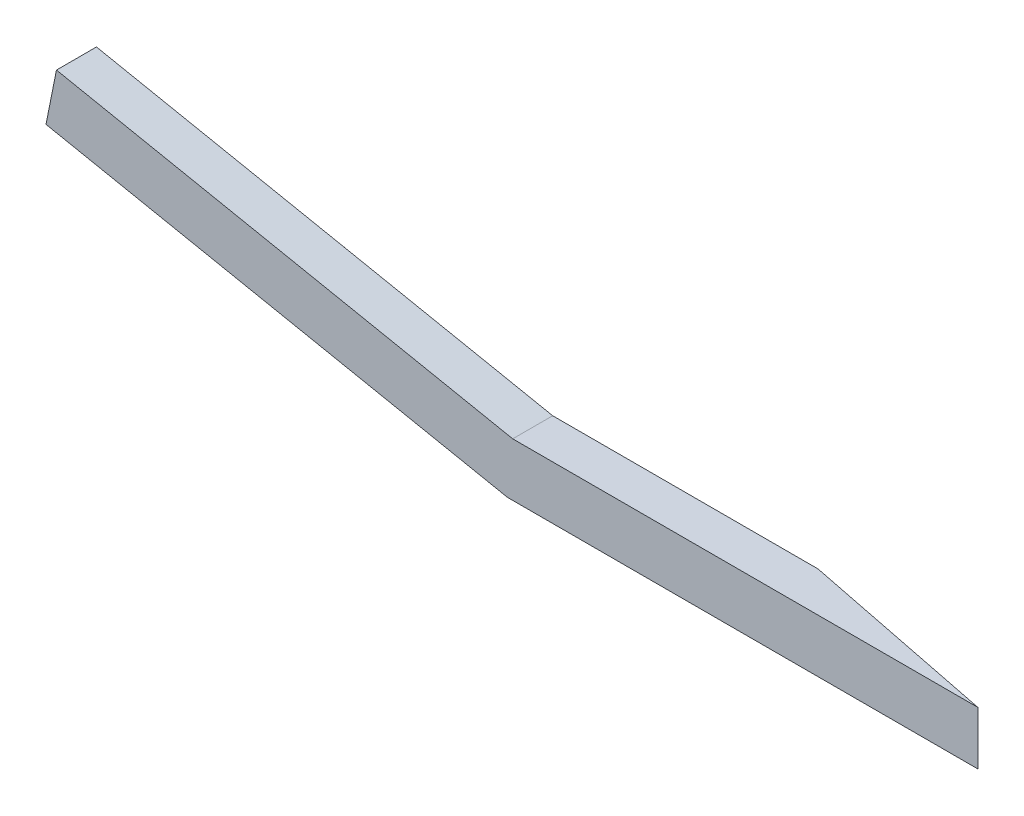
ISO-10303-21;
HEADER;
FILE_DESCRIPTION(('STEP AP214'),'2;1');
FILE_NAME('part.step','',(''),(''),'','','');
FILE_SCHEMA(('AUTOMOTIVE_DESIGN { 1 0 10303 214 1 1 1 1 }'));
ENDSEC;
DATA;
#1=APPLICATION_CONTEXT('core data for automotive mechanical design processes');
#2=APPLICATION_PROTOCOL_DEFINITION('international standard','automotive_design',2000,#1);
#3=PRODUCT_CONTEXT('',#1,'mechanical');
#4=PRODUCT('Part','Part','',(#3));
#5=PRODUCT_RELATED_PRODUCT_CATEGORY('part','',(#4));
#6=PRODUCT_DEFINITION_FORMATION('','',#4);
#7=PRODUCT_DEFINITION_CONTEXT('part definition',#1,'design');
#8=PRODUCT_DEFINITION('design','',#6,#7);
#9=PRODUCT_DEFINITION_SHAPE('','',#8);
#10=(LENGTH_UNIT() NAMED_UNIT(*) SI_UNIT(.MILLI.,.METRE.));
#11=(NAMED_UNIT(*) PLANE_ANGLE_UNIT() SI_UNIT($,.RADIAN.));
#12=(NAMED_UNIT(*) SI_UNIT($,.STERADIAN.) SOLID_ANGLE_UNIT());
#13=UNCERTAINTY_MEASURE_WITH_UNIT(LENGTH_MEASURE(1.E-05),#10,'distance_accuracy_value','');
#14=(GEOMETRIC_REPRESENTATION_CONTEXT(3) GLOBAL_UNCERTAINTY_ASSIGNED_CONTEXT((#13)) GLOBAL_UNIT_ASSIGNED_CONTEXT((#10,
#11,#12)) REPRESENTATION_CONTEXT('',''));
#15=CARTESIAN_POINT('',(0.,0.,0.));
#16=DIRECTION('',(0.,0.,1.));
#17=DIRECTION('',(1.,0.,0.));
#18=AXIS2_PLACEMENT_3D('',#15,#16,#17);
#19=CARTESIAN_POINT('',(-1.87871976637552,1.7,0.122275657166917));
#20=DIRECTION('',(0.,0.,1.));
#21=DIRECTION('',(1.,0.,0.));
#22=AXIS2_PLACEMENT_3D('',#19,#20,#21);
#23=PLANE('',#22);
#24=DIRECTION('',(-1.,0.,0.));
#25=VECTOR('',#24,1.);
#26=CARTESIAN_POINT('',(-1.87871976637552,0.,0.122275657166917));
#27=LINE('',#26,#25);
#28=CARTESIAN_POINT('',(6.74750584154404,0.,0.122275657166917));
#29=VERTEX_POINT('',#28);
#30=CARTESIAN_POINT('',(-1.87871976637552,0.,0.122275657166917));
#31=VERTEX_POINT('',#30);
#32=EDGE_CURVE('E111',#29,#31,#27,.T.);
#33=ORIENTED_EDGE('',*,*,#32,.T.);
#34=DIRECTION('',(0.980580675704682,-0.196116135069374,0.));
#35=VECTOR('',#34,1.);
#36=CARTESIAN_POINT('',(-1.87871976637552,0.,0.122275657166917));
#37=LINE('',#36,#35);
#38=CARTESIAN_POINT('',(-16.5874299019458,2.9417420260406,0.122275657166917));
#39=VERTEX_POINT('',#38);
#40=EDGE_CURVE('E99',#39,#31,#37,.T.);
#41=ORIENTED_EDGE('',*,*,#40,.F.);
#42=DIRECTION('',(-0.196116135069374,-0.980580675704682,0.));
#43=VECTOR('',#42,1.);
#44=CARTESIAN_POINT('',(-16.5874299019458,2.9417420260406,0.122275657166917));
#45=LINE('',#44,#43);
#46=CARTESIAN_POINT('',(-16.2540324723278,4.60872917473856,0.122275657166917));
#47=VERTEX_POINT('',#46);
#48=EDGE_CURVE('E89',#47,#39,#45,.T.);
#49=ORIENTED_EDGE('',*,*,#48,.F.);
#50=DIRECTION('',(-0.980580675704682,0.196116135069374,0.));
#51=VECTOR('',#50,1.);
#52=CARTESIAN_POINT('',(-16.2540324723278,4.60872917473856,0.122275657166917));
#53=LINE('',#52,#51);
#54=CARTESIAN_POINT('',(-1.71038659332807,1.7,0.122275657166917));
#55=VERTEX_POINT('',#54);
#56=EDGE_CURVE('E81',#55,#47,#53,.T.);
#57=ORIENTED_EDGE('',*,*,#56,.F.);
#58=DIRECTION('',(-1.,0.,0.));
#59=VECTOR('',#58,1.);
#60=CARTESIAN_POINT('',(-1.87871976637552,1.7,0.122275657166917));
#61=LINE('',#60,#59);
#62=CARTESIAN_POINT('',(6.74750584154404,1.7,0.122275657166917));
#63=VERTEX_POINT('',#62);
#64=EDGE_CURVE('E50',#63,#55,#61,.T.);
#65=ORIENTED_EDGE('',*,*,#64,.F.);
#66=DIRECTION('',(0.,-1.,0.));
#67=VECTOR('',#66,1.);
#68=CARTESIAN_POINT('',(6.74750584154404,1.7,0.122275657166917));
#69=LINE('',#68,#67);
#70=EDGE_CURVE('E119',#63,#29,#69,.T.);
#71=ORIENTED_EDGE('',*,*,#70,.T.);
#72=EDGE_LOOP('',(#33,#41,#49,#57,#65,#71));
#73=FACE_BOUND('',#72,.T.);
#74=ADVANCED_FACE('F33',(#73),#23,.F.);
#75=CARTESIAN_POINT('',(13.1212802336245,1.7,1.39703053511784));
#76=DIRECTION('',(0.,0.,-1.));
#77=DIRECTION('',(-1.,0.,0.));
#78=AXIS2_PLACEMENT_3D('',#75,#76,#77);
#79=PLANE('',#78);
#80=DIRECTION('',(0.980580675704682,-0.196116135069374,0.));
#81=VECTOR('',#80,1.);
#82=CARTESIAN_POINT('',(-1.87871976637552,0.,1.39703053511785));
#83=LINE('',#82,#81);
#84=CARTESIAN_POINT('',(-16.5874299019458,2.9417420260406,1.39703053511785));
#85=VERTEX_POINT('',#84);
#86=CARTESIAN_POINT('',(-1.87871976637552,0.,1.39703053511785));
#87=VERTEX_POINT('',#86);
#88=EDGE_CURVE('E90',#85,#87,#83,.T.);
#89=ORIENTED_EDGE('',*,*,#88,.T.);
#90=DIRECTION('',(1.,0.,0.));
#91=VECTOR('',#90,1.);
#92=CARTESIAN_POINT('',(13.1212802336245,0.,1.39703053511784));
#93=LINE('',#92,#91);
#94=CARTESIAN_POINT('',(13.1212802336245,0.,1.39703053511784));
#95=VERTEX_POINT('',#94);
#96=EDGE_CURVE('E124',#87,#95,#93,.T.);
#97=ORIENTED_EDGE('',*,*,#96,.T.);
#98=DIRECTION('',(0.,-1.,0.));
#99=VECTOR('',#98,1.);
#100=CARTESIAN_POINT('',(13.1212802336245,1.7,1.39703053511784));
#101=LINE('',#100,#99);
#102=CARTESIAN_POINT('',(13.1212802336245,1.7,1.39703053511784));
#103=VERTEX_POINT('',#102);
#104=EDGE_CURVE('E40',#103,#95,#101,.T.);
#105=ORIENTED_EDGE('',*,*,#104,.F.);
#106=DIRECTION('',(1.,0.,0.));
#107=VECTOR('',#106,1.);
#108=CARTESIAN_POINT('',(13.1212802336245,1.7,1.39703053511784));
#109=LINE('',#108,#107);
#110=CARTESIAN_POINT('',(-1.71038659332807,1.7,1.39703053511785));
#111=VERTEX_POINT('',#110);
#112=EDGE_CURVE('E114',#111,#103,#109,.T.);
#113=ORIENTED_EDGE('',*,*,#112,.F.);
#114=DIRECTION('',(-0.980580675704682,0.196116135069374,0.));
#115=VECTOR('',#114,1.);
#116=CARTESIAN_POINT('',(-16.2540324723278,4.60872917473856,1.39703053511785));
#117=LINE('',#116,#115);
#118=CARTESIAN_POINT('',(-16.2540324723278,4.60872917473856,1.39703053511785));
#119=VERTEX_POINT('',#118);
#120=EDGE_CURVE('E106',#111,#119,#117,.T.);
#121=ORIENTED_EDGE('',*,*,#120,.T.);
#122=DIRECTION('',(-0.196116135069374,-0.980580675704682,0.));
#123=VECTOR('',#122,1.);
#124=CARTESIAN_POINT('',(-16.5874299019458,2.9417420260406,1.39703053511785));
#125=LINE('',#124,#123);
#126=EDGE_CURVE('E97',#119,#85,#125,.T.);
#127=ORIENTED_EDGE('',*,*,#126,.T.);
#128=EDGE_LOOP('',(#89,#97,#105,#113,#121,#127));
#129=FACE_BOUND('',#128,.T.);
#130=ADVANCED_FACE('F142',(#129),#79,.F.);
#131=CARTESIAN_POINT('',(6.74750584154404,1.7,0.122275657166917));
#132=DIRECTION('',(-0.196116135069374,0.,0.980580675704682));
#133=DIRECTION('',(0.980580675704682,0.,0.196116135069374));
#134=AXIS2_PLACEMENT_3D('',#131,#132,#133);
#135=PLANE('',#134);
#136=DIRECTION('',(-0.980580675704682,0.,-0.196116135069374));
#137=VECTOR('',#136,1.);
#138=CARTESIAN_POINT('',(6.74750584154404,0.,0.122275657166917));
#139=LINE('',#138,#137);
#140=EDGE_CURVE('E115',#95,#29,#139,.T.);
#141=ORIENTED_EDGE('',*,*,#140,.T.);
#142=ORIENTED_EDGE('',*,*,#70,.F.);
#143=DIRECTION('',(-0.980580675704682,0.,-0.196116135069374));
#144=VECTOR('',#143,1.);
#145=CARTESIAN_POINT('',(6.74750584154404,1.7,0.122275657166917));
#146=LINE('',#145,#144);
#147=EDGE_CURVE('E117',#103,#63,#146,.T.);
#148=ORIENTED_EDGE('',*,*,#147,.F.);
#149=ORIENTED_EDGE('',*,*,#104,.T.);
#150=EDGE_LOOP('',(#141,#142,#148,#149));
#151=FACE_BOUND('',#150,.T.);
#152=ADVANCED_FACE('F133',(#151),#135,.F.);
#153=CARTESIAN_POINT('',(0.,1.7,0.));
#154=DIRECTION('',(0.,1.,0.));
#155=DIRECTION('',(0.,0.,1.));
#156=AXIS2_PLACEMENT_3D('',#153,#154,#155);
#157=PLANE('',#156);
#158=DIRECTION('',(0.,0.,-1.));
#159=VECTOR('',#158,1.);
#160=CARTESIAN_POINT('',(-1.71038659332805,1.7,0.));
#161=LINE('',#160,#159);
#162=EDGE_CURVE('E11',#111,#55,#161,.T.);
#163=ORIENTED_EDGE('',*,*,#162,.F.);
#164=ORIENTED_EDGE('',*,*,#112,.T.);
#165=ORIENTED_EDGE('',*,*,#147,.T.);
#166=ORIENTED_EDGE('',*,*,#64,.T.);
#167=EDGE_LOOP('',(#163,#164,#165,#166));
#168=FACE_BOUND('',#167,.T.);
#169=ADVANCED_FACE('F143',(#168),#157,.T.);
#170=CARTESIAN_POINT('',(0.,0.,0.));
#171=DIRECTION('',(0.,1.,0.));
#172=DIRECTION('',(0.,0.,1.));
#173=AXIS2_PLACEMENT_3D('',#170,#171,#172);
#174=PLANE('',#173);
#175=ORIENTED_EDGE('',*,*,#32,.F.);
#176=ORIENTED_EDGE('',*,*,#140,.F.);
#177=ORIENTED_EDGE('',*,*,#96,.F.);
#178=DIRECTION('',(0.,0.,1.));
#179=VECTOR('',#178,1.);
#180=CARTESIAN_POINT('',(-1.87871976637552,0.,1.39703053511785));
#181=LINE('',#180,#179);
#182=EDGE_CURVE('E121',#31,#87,#181,.T.);
#183=ORIENTED_EDGE('',*,*,#182,.F.);
#184=EDGE_LOOP('',(#175,#176,#177,#183));
#185=FACE_BOUND('',#184,.T.);
#186=ADVANCED_FACE('F138',(#185),#174,.F.);
#187=CARTESIAN_POINT('',(-1.87871976637552,0.,0.122275657166917));
#188=DIRECTION('',(-0.196116135069374,-0.980580675704682,0.));
#189=DIRECTION('',(0.980580675704682,-0.196116135069374,0.));
#190=AXIS2_PLACEMENT_3D('',#187,#188,#189);
#191=PLANE('',#190);
#192=ORIENTED_EDGE('',*,*,#88,.F.);
#193=DIRECTION('',(0.,0.,1.));
#194=VECTOR('',#193,1.);
#195=CARTESIAN_POINT('',(-16.5874299019458,2.9417420260406,0.122275657166917));
#196=LINE('',#195,#194);
#197=EDGE_CURVE('E98',#39,#85,#196,.T.);
#198=ORIENTED_EDGE('',*,*,#197,.F.);
#199=ORIENTED_EDGE('',*,*,#40,.T.);
#200=ORIENTED_EDGE('',*,*,#182,.T.);
#201=EDGE_LOOP('',(#192,#198,#199,#200));
#202=FACE_BOUND('',#201,.T.);
#203=ADVANCED_FACE('F141',(#202),#191,.T.);
#204=CARTESIAN_POINT('',(-16.5874299019458,2.9417420260406,0.122275657166917));
#205=DIRECTION('',(-0.980580675704682,0.196116135069374,0.));
#206=DIRECTION('',(-0.196116135069374,-0.980580675704682,0.));
#207=AXIS2_PLACEMENT_3D('',#204,#205,#206);
#208=PLANE('',#207);
#209=ORIENTED_EDGE('',*,*,#126,.F.);
#210=DIRECTION('',(0.,0.,1.));
#211=VECTOR('',#210,1.);
#212=CARTESIAN_POINT('',(-16.2540324723278,4.60872917473856,0.122275657166917));
#213=LINE('',#212,#211);
#214=EDGE_CURVE('E85',#47,#119,#213,.T.);
#215=ORIENTED_EDGE('',*,*,#214,.F.);
#216=ORIENTED_EDGE('',*,*,#48,.T.);
#217=ORIENTED_EDGE('',*,*,#197,.T.);
#218=EDGE_LOOP('',(#209,#215,#216,#217));
#219=FACE_BOUND('',#218,.T.);
#220=ADVANCED_FACE('F94',(#219),#208,.T.);
#221=CARTESIAN_POINT('',(-16.2540324723278,4.60872917473856,0.122275657166917));
#222=DIRECTION('',(0.196116135069374,0.980580675704682,0.));
#223=DIRECTION('',(-0.980580675704682,0.196116135069374,0.));
#224=AXIS2_PLACEMENT_3D('',#221,#222,#223);
#225=PLANE('',#224);
#226=ORIENTED_EDGE('',*,*,#120,.F.);
#227=ORIENTED_EDGE('',*,*,#162,.T.);
#228=ORIENTED_EDGE('',*,*,#56,.T.);
#229=ORIENTED_EDGE('',*,*,#214,.T.);
#230=EDGE_LOOP('',(#226,#227,#228,#229));
#231=FACE_BOUND('',#230,.T.);
#232=ADVANCED_FACE('F84',(#231),#225,.T.);
#233=CLOSED_SHELL('',(#74,#130,#152,#169,#186,#203,#220,#232));
#234=MANIFOLD_SOLID_BREP('B2',#233);
#235=ADVANCED_BREP_SHAPE_REPRESENTATION('',(#18,#234),#14);
#236=SHAPE_DEFINITION_REPRESENTATION(#9,#235);
ENDSEC;
END-ISO-10303-21;
